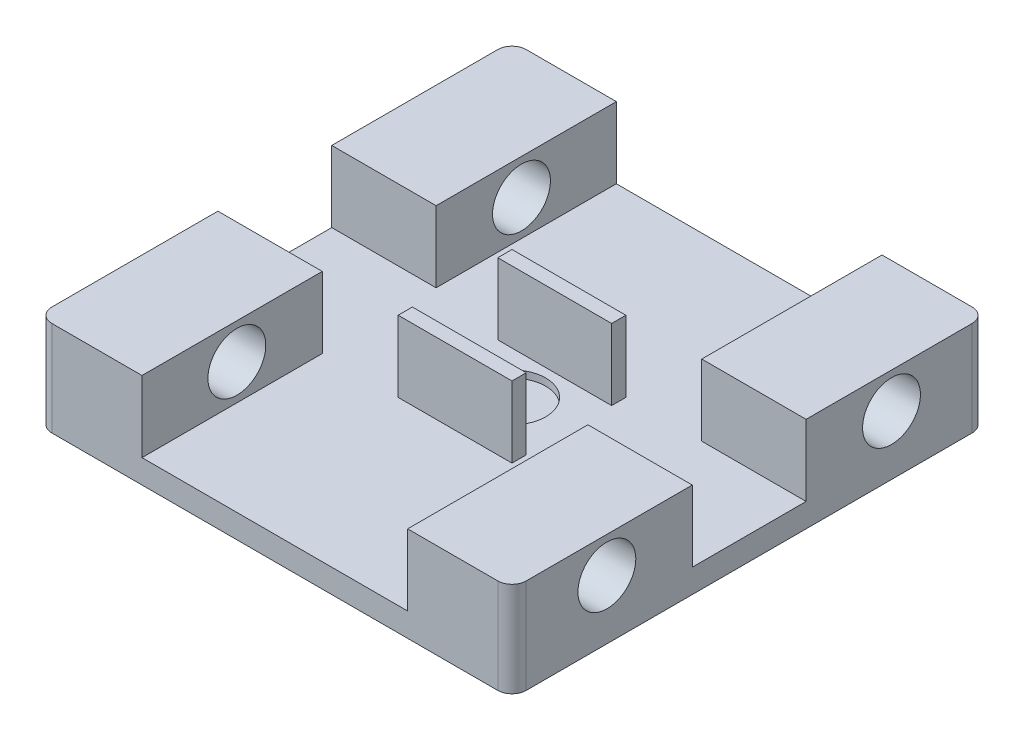
ISO-10303-21;
HEADER;
FILE_DESCRIPTION(('STEP AP214'),'2;1');
FILE_NAME('part.step','',(''),(''),'','','');
FILE_SCHEMA(('AUTOMOTIVE_DESIGN { 1 0 10303 214 1 1 1 1 }'));
ENDSEC;
DATA;
#1=APPLICATION_CONTEXT('core data for automotive mechanical design processes');
#2=APPLICATION_PROTOCOL_DEFINITION('international standard','automotive_design',2000,#1);
#3=PRODUCT_CONTEXT('',#1,'mechanical');
#4=PRODUCT('Part','Part','',(#3));
#5=PRODUCT_RELATED_PRODUCT_CATEGORY('part','',(#4));
#6=PRODUCT_DEFINITION_FORMATION('','',#4);
#7=PRODUCT_DEFINITION_CONTEXT('part definition',#1,'design');
#8=PRODUCT_DEFINITION('design','',#6,#7);
#9=PRODUCT_DEFINITION_SHAPE('','',#8);
#10=(LENGTH_UNIT() NAMED_UNIT(*) SI_UNIT(.MILLI.,.METRE.));
#11=(NAMED_UNIT(*) PLANE_ANGLE_UNIT() SI_UNIT($,.RADIAN.));
#12=(NAMED_UNIT(*) SI_UNIT($,.STERADIAN.) SOLID_ANGLE_UNIT());
#13=UNCERTAINTY_MEASURE_WITH_UNIT(LENGTH_MEASURE(1.E-05),#10,'distance_accuracy_value','');
#14=(GEOMETRIC_REPRESENTATION_CONTEXT(3) GLOBAL_UNCERTAINTY_ASSIGNED_CONTEXT((#13)) GLOBAL_UNIT_ASSIGNED_CONTEXT((#10,
#11,#12)) REPRESENTATION_CONTEXT('',''));
#15=CARTESIAN_POINT('',(0.,0.,0.));
#16=DIRECTION('',(0.,0.,1.));
#17=DIRECTION('',(1.,0.,0.));
#18=AXIS2_PLACEMENT_3D('',#15,#16,#17);
#19=CARTESIAN_POINT('',(0.,20.,0.));
#20=DIRECTION('',(0.,-1.,0.));
#21=DIRECTION('',(0.,0.,-1.));
#22=AXIS2_PLACEMENT_3D('',#19,#20,#21);
#23=PLANE('',#22);
#24=DIRECTION('',(0.,0.,-1.));
#25=VECTOR('',#24,1.);
#26=CARTESIAN_POINT('',(12.,20.,-12.));
#27=LINE('',#26,#25);
#28=CARTESIAN_POINT('',(12.,20.,12.));
#29=VERTEX_POINT('',#28);
#30=CARTESIAN_POINT('',(12.,20.,9.));
#31=VERTEX_POINT('',#30);
#32=EDGE_CURVE('E61',#29,#31,#27,.T.);
#33=ORIENTED_EDGE('',*,*,#32,.T.);
#34=DIRECTION('',(1.,0.,0.));
#35=VECTOR('',#34,1.);
#36=CARTESIAN_POINT('',(-20.,20.,9.));
#37=LINE('',#36,#35);
#38=CARTESIAN_POINT('',(-12.,20.,9.));
#39=VERTEX_POINT('',#38);
#40=EDGE_CURVE('E607',#39,#31,#37,.T.);
#41=ORIENTED_EDGE('',*,*,#40,.F.);
#42=DIRECTION('',(0.,0.,1.));
#43=VECTOR('',#42,1.);
#44=CARTESIAN_POINT('',(-12.,20.,-12.));
#45=LINE('',#44,#43);
#46=CARTESIAN_POINT('',(-12.,20.,12.));
#47=VERTEX_POINT('',#46);
#48=EDGE_CURVE('E266',#39,#47,#45,.T.);
#49=ORIENTED_EDGE('',*,*,#48,.T.);
#50=DIRECTION('',(1.,0.,0.));
#51=VECTOR('',#50,1.);
#52=CARTESIAN_POINT('',(12.,20.,12.));
#53=LINE('',#52,#51);
#54=EDGE_CURVE('E265',#47,#29,#53,.T.);
#55=ORIENTED_EDGE('',*,*,#54,.T.);
#56=EDGE_LOOP('',(#33,#41,#49,#55));
#57=FACE_BOUND('',#56,.T.);
#58=ADVANCED_FACE('F37',(#57),#23,.F.);
#59=CARTESIAN_POINT('',(-12.,5.,-12.));
#60=DIRECTION('',(-1.,0.,0.));
#61=DIRECTION('',(0.,0.,1.));
#62=AXIS2_PLACEMENT_3D('',#59,#60,#61);
#63=PLANE('',#62);
#64=DIRECTION('',(0.,1.,0.));
#65=VECTOR('',#64,1.);
#66=CARTESIAN_POINT('',(-12.,4.99999999999999,9.));
#67=LINE('',#66,#65);
#68=CARTESIAN_POINT('',(-12.,5.,9.));
#69=VERTEX_POINT('',#68);
#70=EDGE_CURVE('E609',#69,#39,#67,.T.);
#71=ORIENTED_EDGE('',*,*,#70,.F.);
#72=DIRECTION('',(0.,0.,1.));
#73=VECTOR('',#72,1.);
#74=CARTESIAN_POINT('',(-12.,5.,-12.));
#75=LINE('',#74,#73);
#76=CARTESIAN_POINT('',(-12.,5.,12.));
#77=VERTEX_POINT('',#76);
#78=EDGE_CURVE('E273',#69,#77,#75,.T.);
#79=ORIENTED_EDGE('',*,*,#78,.T.);
#80=DIRECTION('',(0.,1.,0.));
#81=VECTOR('',#80,1.);
#82=CARTESIAN_POINT('',(-12.,5.,12.));
#83=LINE('',#82,#81);
#84=EDGE_CURVE('E261',#77,#47,#83,.T.);
#85=ORIENTED_EDGE('',*,*,#84,.T.);
#86=ORIENTED_EDGE('',*,*,#48,.F.);
#87=EDGE_LOOP('',(#71,#79,#85,#86));
#88=FACE_BOUND('',#87,.T.);
#89=ADVANCED_FACE('F479',(#88),#63,.T.);
#90=CARTESIAN_POINT('',(12.,5.,-12.));
#91=DIRECTION('',(1.,0.,0.));
#92=DIRECTION('',(0.,0.,-1.));
#93=AXIS2_PLACEMENT_3D('',#90,#91,#92);
#94=PLANE('',#93);
#95=DIRECTION('',(0.,-1.,0.));
#96=VECTOR('',#95,1.);
#97=CARTESIAN_POINT('',(12.,20.,9.));
#98=LINE('',#97,#96);
#99=CARTESIAN_POINT('',(12.,5.,9.));
#100=VERTEX_POINT('',#99);
#101=EDGE_CURVE('E54',#31,#100,#98,.T.);
#102=ORIENTED_EDGE('',*,*,#101,.F.);
#103=ORIENTED_EDGE('',*,*,#32,.F.);
#104=DIRECTION('',(0.,1.,0.));
#105=VECTOR('',#104,1.);
#106=CARTESIAN_POINT('',(12.,5.,12.));
#107=LINE('',#106,#105);
#108=CARTESIAN_POINT('',(12.,5.,12.));
#109=VERTEX_POINT('',#108);
#110=EDGE_CURVE('E279',#109,#29,#107,.T.);
#111=ORIENTED_EDGE('',*,*,#110,.F.);
#112=DIRECTION('',(0.,0.,-1.));
#113=VECTOR('',#112,1.);
#114=CARTESIAN_POINT('',(12.,5.,-12.));
#115=LINE('',#114,#113);
#116=EDGE_CURVE('E251',#109,#100,#115,.T.);
#117=ORIENTED_EDGE('',*,*,#116,.T.);
#118=EDGE_LOOP('',(#102,#103,#111,#117));
#119=FACE_BOUND('',#118,.T.);
#120=ADVANCED_FACE('F472',(#119),#94,.T.);
#121=CARTESIAN_POINT('',(-12.,20.,-12.));
#122=VERTEX_POINT('',#121);
#123=CARTESIAN_POINT('',(-12.,20.,-9.));
#124=VERTEX_POINT('',#123);
#125=EDGE_CURVE('E262',#122,#124,#45,.T.);
#126=ORIENTED_EDGE('',*,*,#125,.T.);
#127=DIRECTION('',(1.,0.,0.));
#128=VECTOR('',#127,1.);
#129=CARTESIAN_POINT('',(-20.,20.,-9.));
#130=LINE('',#129,#128);
#131=CARTESIAN_POINT('',(12.,20.,-9.));
#132=VERTEX_POINT('',#131);
#133=EDGE_CURVE('E235',#124,#132,#130,.T.);
#134=ORIENTED_EDGE('',*,*,#133,.T.);
#135=CARTESIAN_POINT('',(12.,20.,-12.));
#136=VERTEX_POINT('',#135);
#137=EDGE_CURVE('E244',#132,#136,#27,.T.);
#138=ORIENTED_EDGE('',*,*,#137,.T.);
#139=DIRECTION('',(-1.,0.,0.));
#140=VECTOR('',#139,1.);
#141=CARTESIAN_POINT('',(12.,20.,-12.));
#142=LINE('',#141,#140);
#143=EDGE_CURVE('E270',#136,#122,#142,.T.);
#144=ORIENTED_EDGE('',*,*,#143,.T.);
#145=EDGE_LOOP('',(#126,#134,#138,#144));
#146=FACE_BOUND('',#145,.T.);
#147=ADVANCED_FACE('F462',(#146),#23,.F.);
#148=CARTESIAN_POINT('',(-28.,5.,-50.));
#149=DIRECTION('',(-1.,0.,0.));
#150=DIRECTION('',(0.,0.,1.));
#151=AXIS2_PLACEMENT_3D('',#148,#149,#150);
#152=PLANE('',#151);
#153=DIRECTION('',(0.,0.,1.));
#154=VECTOR('',#153,1.);
#155=CARTESIAN_POINT('',(-28.,20.,-50.));
#156=LINE('',#155,#154);
#157=CARTESIAN_POINT('',(-28.,20.,-50.));
#158=VERTEX_POINT('',#157);
#159=CARTESIAN_POINT('',(-28.,20.,-12.));
#160=VERTEX_POINT('',#159);
#161=EDGE_CURVE('E326',#158,#160,#156,.T.);
#162=ORIENTED_EDGE('',*,*,#161,.T.);
#163=DIRECTION('',(0.,1.,0.));
#164=VECTOR('',#163,1.);
#165=CARTESIAN_POINT('',(-28.,5.,-12.));
#166=LINE('',#165,#164);
#167=CARTESIAN_POINT('',(-28.,5.,-12.));
#168=VERTEX_POINT('',#167);
#169=EDGE_CURVE('E353',#168,#160,#166,.T.);
#170=ORIENTED_EDGE('',*,*,#169,.F.);
#171=DIRECTION('',(0.,0.,1.));
#172=VECTOR('',#171,1.);
#173=CARTESIAN_POINT('',(-28.,5.,-50.));
#174=LINE('',#173,#172);
#175=CARTESIAN_POINT('',(-28.,5.,-50.));
#176=VERTEX_POINT('',#175);
#177=EDGE_CURVE('E299',#176,#168,#174,.T.);
#178=ORIENTED_EDGE('',*,*,#177,.F.);
#179=DIRECTION('',(0.,1.,0.));
#180=VECTOR('',#179,1.);
#181=CARTESIAN_POINT('',(-28.,5.,-50.));
#182=LINE('',#181,#180);
#183=EDGE_CURVE('E355',#176,#158,#182,.T.);
#184=ORIENTED_EDGE('',*,*,#183,.T.);
#185=EDGE_LOOP('',(#162,#170,#178,#184));
#186=FACE_BOUND('',#185,.T.);
#187=CARTESIAN_POINT('',(-28.,12.5,-30.));
#188=DIRECTION('',(-1.,0.,0.));
#189=DIRECTION('',(0.,0.,1.));
#190=AXIS2_PLACEMENT_3D('',#187,#188,#189);
#191=CIRCLE('',#190,6.1);
#192=CARTESIAN_POINT('',(-28.,12.5,-23.9));
#193=VERTEX_POINT('',#192);
#194=EDGE_CURVE('E41',#193,#193,#191,.F.);
#195=ORIENTED_EDGE('',*,*,#194,.F.);
#196=EDGE_LOOP('',(#195));
#197=FACE_BOUND('',#196,.T.);
#198=ADVANCED_FACE('F459',(#186,#197),#152,.F.);
#199=CARTESIAN_POINT('',(28.,5.,-50.));
#200=DIRECTION('',(1.,0.,0.));
#201=DIRECTION('',(0.,0.,-1.));
#202=AXIS2_PLACEMENT_3D('',#199,#200,#201);
#203=PLANE('',#202);
#204=DIRECTION('',(0.,0.,-1.));
#205=VECTOR('',#204,1.);
#206=CARTESIAN_POINT('',(28.,20.,-50.));
#207=LINE('',#206,#205);
#208=CARTESIAN_POINT('',(28.,20.,-12.));
#209=VERTEX_POINT('',#208);
#210=CARTESIAN_POINT('',(28.,20.,-50.));
#211=VERTEX_POINT('',#210);
#212=EDGE_CURVE('E324',#209,#211,#207,.T.);
#213=ORIENTED_EDGE('',*,*,#212,.T.);
#214=DIRECTION('',(0.,1.,0.));
#215=VECTOR('',#214,1.);
#216=CARTESIAN_POINT('',(28.,5.,-50.));
#217=LINE('',#216,#215);
#218=CARTESIAN_POINT('',(28.,5.,-50.));
#219=VERTEX_POINT('',#218);
#220=EDGE_CURVE('E357',#219,#211,#217,.T.);
#221=ORIENTED_EDGE('',*,*,#220,.F.);
#222=DIRECTION('',(0.,0.,-1.));
#223=VECTOR('',#222,1.);
#224=CARTESIAN_POINT('',(28.,5.,-50.));
#225=LINE('',#224,#223);
#226=CARTESIAN_POINT('',(28.,5.,-12.));
#227=VERTEX_POINT('',#226);
#228=EDGE_CURVE('E293',#227,#219,#225,.T.);
#229=ORIENTED_EDGE('',*,*,#228,.F.);
#230=DIRECTION('',(0.,1.,0.));
#231=VECTOR('',#230,1.);
#232=CARTESIAN_POINT('',(28.,5.,-12.));
#233=LINE('',#232,#231);
#234=EDGE_CURVE('E360',#227,#209,#233,.T.);
#235=ORIENTED_EDGE('',*,*,#234,.T.);
#236=EDGE_LOOP('',(#213,#221,#229,#235));
#237=FACE_BOUND('',#236,.T.);
#238=CARTESIAN_POINT('',(28.,12.5,-30.));
#239=DIRECTION('',(1.,0.,0.));
#240=DIRECTION('',(0.,0.,-1.));
#241=AXIS2_PLACEMENT_3D('',#238,#239,#240);
#242=CIRCLE('',#241,6.1);
#243=CARTESIAN_POINT('',(28.,12.5,-36.1));
#244=VERTEX_POINT('',#243);
#245=EDGE_CURVE('E449',#244,#244,#242,.F.);
#246=ORIENTED_EDGE('',*,*,#245,.F.);
#247=EDGE_LOOP('',(#246));
#248=FACE_BOUND('',#247,.T.);
#249=ADVANCED_FACE('F461',(#237,#248),#203,.F.);
#250=CARTESIAN_POINT('',(28.,5.,12.));
#251=DIRECTION('',(1.,0.,0.));
#252=DIRECTION('',(0.,0.,-1.));
#253=AXIS2_PLACEMENT_3D('',#250,#251,#252);
#254=PLANE('',#253);
#255=DIRECTION('',(0.,0.,-1.));
#256=VECTOR('',#255,1.);
#257=CARTESIAN_POINT('',(28.,20.,12.));
#258=LINE('',#257,#256);
#259=CARTESIAN_POINT('',(28.,20.,50.));
#260=VERTEX_POINT('',#259);
#261=CARTESIAN_POINT('',(28.,20.,12.));
#262=VERTEX_POINT('',#261);
#263=EDGE_CURVE('E287',#260,#262,#258,.T.);
#264=ORIENTED_EDGE('',*,*,#263,.T.);
#265=DIRECTION('',(0.,1.,0.));
#266=VECTOR('',#265,1.);
#267=CARTESIAN_POINT('',(28.,5.,12.));
#268=LINE('',#267,#266);
#269=CARTESIAN_POINT('',(28.,5.,12.));
#270=VERTEX_POINT('',#269);
#271=EDGE_CURVE('E338',#270,#262,#268,.T.);
#272=ORIENTED_EDGE('',*,*,#271,.F.);
#273=DIRECTION('',(0.,0.,-1.));
#274=VECTOR('',#273,1.);
#275=CARTESIAN_POINT('',(28.,5.,12.));
#276=LINE('',#275,#274);
#277=CARTESIAN_POINT('',(28.,5.,50.));
#278=VERTEX_POINT('',#277);
#279=EDGE_CURVE('E316',#278,#270,#276,.T.);
#280=ORIENTED_EDGE('',*,*,#279,.F.);
#281=DIRECTION('',(0.,1.,0.));
#282=VECTOR('',#281,1.);
#283=CARTESIAN_POINT('',(28.,5.,50.));
#284=LINE('',#283,#282);
#285=EDGE_CURVE('E341',#278,#260,#284,.T.);
#286=ORIENTED_EDGE('',*,*,#285,.T.);
#287=EDGE_LOOP('',(#264,#272,#280,#286));
#288=FACE_BOUND('',#287,.T.);
#289=CARTESIAN_POINT('',(28.,12.5,30.));
#290=DIRECTION('',(1.,0.,0.));
#291=DIRECTION('',(0.,0.,-1.));
#292=AXIS2_PLACEMENT_3D('',#289,#290,#291);
#293=CIRCLE('',#292,6.1);
#294=CARTESIAN_POINT('',(28.,12.5,23.9));
#295=VERTEX_POINT('',#294);
#296=EDGE_CURVE('E447',#295,#295,#293,.F.);
#297=ORIENTED_EDGE('',*,*,#296,.F.);
#298=EDGE_LOOP('',(#297));
#299=FACE_BOUND('',#298,.T.);
#300=ADVANCED_FACE('F469',(#288,#299),#254,.F.);
#301=CARTESIAN_POINT('',(-28.,5.,12.));
#302=DIRECTION('',(-1.,0.,0.));
#303=DIRECTION('',(0.,0.,1.));
#304=AXIS2_PLACEMENT_3D('',#301,#302,#303);
#305=PLANE('',#304);
#306=DIRECTION('',(0.,0.,1.));
#307=VECTOR('',#306,1.);
#308=CARTESIAN_POINT('',(-28.,20.,12.));
#309=LINE('',#308,#307);
#310=CARTESIAN_POINT('',(-28.,20.,12.));
#311=VERTEX_POINT('',#310);
#312=CARTESIAN_POINT('',(-28.,20.,50.));
#313=VERTEX_POINT('',#312);
#314=EDGE_CURVE('E334',#311,#313,#309,.T.);
#315=ORIENTED_EDGE('',*,*,#314,.T.);
#316=DIRECTION('',(0.,1.,0.));
#317=VECTOR('',#316,1.);
#318=CARTESIAN_POINT('',(-28.,5.,50.));
#319=LINE('',#318,#317);
#320=CARTESIAN_POINT('',(-28.,5.,50.));
#321=VERTEX_POINT('',#320);
#322=EDGE_CURVE('E343',#321,#313,#319,.T.);
#323=ORIENTED_EDGE('',*,*,#322,.F.);
#324=DIRECTION('',(0.,0.,1.));
#325=VECTOR('',#324,1.);
#326=CARTESIAN_POINT('',(-28.,5.,12.));
#327=LINE('',#326,#325);
#328=CARTESIAN_POINT('',(-28.,5.,12.));
#329=VERTEX_POINT('',#328);
#330=EDGE_CURVE('E311',#329,#321,#327,.T.);
#331=ORIENTED_EDGE('',*,*,#330,.F.);
#332=DIRECTION('',(0.,1.,0.));
#333=VECTOR('',#332,1.);
#334=CARTESIAN_POINT('',(-28.,5.,12.));
#335=LINE('',#334,#333);
#336=EDGE_CURVE('E346',#329,#311,#335,.T.);
#337=ORIENTED_EDGE('',*,*,#336,.T.);
#338=EDGE_LOOP('',(#315,#323,#331,#337));
#339=FACE_BOUND('',#338,.T.);
#340=CARTESIAN_POINT('',(-28.,12.5,30.));
#341=DIRECTION('',(-1.,0.,0.));
#342=DIRECTION('',(0.,0.,1.));
#343=AXIS2_PLACEMENT_3D('',#340,#341,#342);
#344=CIRCLE('',#343,6.1);
#345=CARTESIAN_POINT('',(-28.,12.5,36.1));
#346=VERTEX_POINT('',#345);
#347=EDGE_CURVE('E340',#346,#346,#344,.F.);
#348=ORIENTED_EDGE('',*,*,#347,.F.);
#349=EDGE_LOOP('',(#348));
#350=FACE_BOUND('',#349,.T.);
#351=ADVANCED_FACE('F571',(#339,#350),#305,.F.);
#352=CARTESIAN_POINT('',(28.,5.,12.));
#353=DIRECTION('',(0.,0.,1.));
#354=DIRECTION('',(1.,0.,0.));
#355=AXIS2_PLACEMENT_3D('',#352,#353,#354);
#356=PLANE('',#355);
#357=DIRECTION('',(1.,0.,0.));
#358=VECTOR('',#357,1.);
#359=CARTESIAN_POINT('',(28.,20.,12.));
#360=LINE('',#359,#358);
#361=CARTESIAN_POINT('',(50.,20.,12.));
#362=VERTEX_POINT('',#361);
#363=EDGE_CURVE('E276',#262,#362,#360,.T.);
#364=ORIENTED_EDGE('',*,*,#363,.T.);
#365=DIRECTION('',(0.,1.,0.));
#366=VECTOR('',#365,1.);
#367=CARTESIAN_POINT('',(50.,5.,12.));
#368=LINE('',#367,#366);
#369=CARTESIAN_POINT('',(50.,5.,12.));
#370=VERTEX_POINT('',#369);
#371=EDGE_CURVE('E319',#370,#362,#368,.T.);
#372=ORIENTED_EDGE('',*,*,#371,.F.);
#373=DIRECTION('',(1.,0.,0.));
#374=VECTOR('',#373,1.);
#375=CARTESIAN_POINT('',(28.,5.,12.));
#376=LINE('',#375,#374);
#377=EDGE_CURVE('E283',#270,#370,#376,.T.);
#378=ORIENTED_EDGE('',*,*,#377,.F.);
#379=ORIENTED_EDGE('',*,*,#271,.T.);
#380=EDGE_LOOP('',(#364,#372,#378,#379));
#381=FACE_BOUND('',#380,.T.);
#382=ADVANCED_FACE('F563',(#381),#356,.F.);
#383=CARTESIAN_POINT('',(-50.,5.,12.));
#384=DIRECTION('',(0.,0.,1.));
#385=DIRECTION('',(1.,0.,0.));
#386=AXIS2_PLACEMENT_3D('',#383,#384,#385);
#387=PLANE('',#386);
#388=DIRECTION('',(1.,0.,0.));
#389=VECTOR('',#388,1.);
#390=CARTESIAN_POINT('',(-50.,20.,12.));
#391=LINE('',#390,#389);
#392=CARTESIAN_POINT('',(-50.,20.,12.));
#393=VERTEX_POINT('',#392);
#394=EDGE_CURVE('E331',#393,#311,#391,.T.);
#395=ORIENTED_EDGE('',*,*,#394,.T.);
#396=ORIENTED_EDGE('',*,*,#336,.F.);
#397=DIRECTION('',(1.,0.,0.));
#398=VECTOR('',#397,1.);
#399=CARTESIAN_POINT('',(-50.,5.,12.));
#400=LINE('',#399,#398);
#401=CARTESIAN_POINT('',(-50.,5.,12.));
#402=VERTEX_POINT('',#401);
#403=EDGE_CURVE('E308',#402,#329,#400,.T.);
#404=ORIENTED_EDGE('',*,*,#403,.F.);
#405=DIRECTION('',(0.,1.,0.));
#406=VECTOR('',#405,1.);
#407=CARTESIAN_POINT('',(-50.,5.,12.));
#408=LINE('',#407,#406);
#409=EDGE_CURVE('E348',#402,#393,#408,.T.);
#410=ORIENTED_EDGE('',*,*,#409,.T.);
#411=EDGE_LOOP('',(#395,#396,#404,#410));
#412=FACE_BOUND('',#411,.T.);
#413=ADVANCED_FACE('F647',(#412),#387,.F.);
#414=CARTESIAN_POINT('',(-50.,5.,-12.));
#415=DIRECTION('',(0.,0.,-1.));
#416=DIRECTION('',(-1.,0.,0.));
#417=AXIS2_PLACEMENT_3D('',#414,#415,#416);
#418=PLANE('',#417);
#419=DIRECTION('',(-1.,0.,0.));
#420=VECTOR('',#419,1.);
#421=CARTESIAN_POINT('',(-50.,20.,-12.));
#422=LINE('',#421,#420);
#423=CARTESIAN_POINT('',(-50.,20.,-12.));
#424=VERTEX_POINT('',#423);
#425=EDGE_CURVE('E329',#160,#424,#422,.T.);
#426=ORIENTED_EDGE('',*,*,#425,.T.);
#427=DIRECTION('',(0.,1.,0.));
#428=VECTOR('',#427,1.);
#429=CARTESIAN_POINT('',(-50.,5.,-12.));
#430=LINE('',#429,#428);
#431=CARTESIAN_POINT('',(-50.,5.,-12.));
#432=VERTEX_POINT('',#431);
#433=EDGE_CURVE('E350',#432,#424,#430,.T.);
#434=ORIENTED_EDGE('',*,*,#433,.F.);
#435=DIRECTION('',(-1.,0.,0.));
#436=VECTOR('',#435,1.);
#437=CARTESIAN_POINT('',(-50.,5.,-12.));
#438=LINE('',#437,#436);
#439=EDGE_CURVE('E302',#168,#432,#438,.T.);
#440=ORIENTED_EDGE('',*,*,#439,.F.);
#441=ORIENTED_EDGE('',*,*,#169,.T.);
#442=EDGE_LOOP('',(#426,#434,#440,#441));
#443=FACE_BOUND('',#442,.T.);
#444=ADVANCED_FACE('F649',(#443),#418,.F.);
#445=CARTESIAN_POINT('',(28.,5.,-12.));
#446=DIRECTION('',(0.,0.,-1.));
#447=DIRECTION('',(-1.,0.,0.));
#448=AXIS2_PLACEMENT_3D('',#445,#446,#447);
#449=PLANE('',#448);
#450=DIRECTION('',(-1.,0.,0.));
#451=VECTOR('',#450,1.);
#452=CARTESIAN_POINT('',(28.,20.,-12.));
#453=LINE('',#452,#451);
#454=CARTESIAN_POINT('',(50.,20.,-12.));
#455=VERTEX_POINT('',#454);
#456=EDGE_CURVE('E321',#455,#209,#453,.T.);
#457=ORIENTED_EDGE('',*,*,#456,.T.);
#458=ORIENTED_EDGE('',*,*,#234,.F.);
#459=DIRECTION('',(-1.,0.,0.));
#460=VECTOR('',#459,1.);
#461=CARTESIAN_POINT('',(28.,5.,-12.));
#462=LINE('',#461,#460);
#463=CARTESIAN_POINT('',(50.,5.,-12.));
#464=VERTEX_POINT('',#463);
#465=EDGE_CURVE('E290',#464,#227,#462,.T.);
#466=ORIENTED_EDGE('',*,*,#465,.F.);
#467=DIRECTION('',(0.,1.,0.));
#468=VECTOR('',#467,1.);
#469=CARTESIAN_POINT('',(50.,5.,-12.));
#470=LINE('',#469,#468);
#471=EDGE_CURVE('E362',#464,#455,#470,.T.);
#472=ORIENTED_EDGE('',*,*,#471,.T.);
#473=EDGE_LOOP('',(#457,#458,#466,#472));
#474=FACE_BOUND('',#473,.T.);
#475=ADVANCED_FACE('F558',(#474),#449,.F.);
#476=CARTESIAN_POINT('',(0.,5.,0.));
#477=DIRECTION('',(0.,-1.,0.));
#478=DIRECTION('',(0.,0.,-1.));
#479=AXIS2_PLACEMENT_3D('',#476,#477,#478);
#480=PLANE('',#479);
#481=DIRECTION('',(1.,0.,0.));
#482=VECTOR('',#481,1.);
#483=CARTESIAN_POINT('',(-20.,5.,-9.));
#484=LINE('',#483,#482);
#485=CARTESIAN_POINT('',(-12.,5.,-9.));
#486=VERTEX_POINT('',#485);
#487=CARTESIAN_POINT('',(12.,5.,-9.));
#488=VERTEX_POINT('',#487);
#489=EDGE_CURVE('E224',#486,#488,#484,.T.);
#490=ORIENTED_EDGE('',*,*,#489,.F.);
#491=CARTESIAN_POINT('',(-12.,5.,-12.));
#492=VERTEX_POINT('',#491);
#493=EDGE_CURVE('E256',#492,#486,#75,.T.);
#494=ORIENTED_EDGE('',*,*,#493,.F.);
#495=DIRECTION('',(-1.,0.,0.));
#496=VECTOR('',#495,1.);
#497=CARTESIAN_POINT('',(12.,5.,-12.));
#498=LINE('',#497,#496);
#499=CARTESIAN_POINT('',(12.,5.,-12.));
#500=VERTEX_POINT('',#499);
#501=EDGE_CURVE('E250',#500,#492,#498,.T.);
#502=ORIENTED_EDGE('',*,*,#501,.F.);
#503=EDGE_CURVE('E242',#488,#500,#115,.T.);
#504=ORIENTED_EDGE('',*,*,#503,.F.);
#505=EDGE_LOOP('',(#490,#494,#502,#504));
#506=FACE_BOUND('',#505,.T.);
#507=ORIENTED_EDGE('',*,*,#78,.F.);
#508=DIRECTION('',(1.,0.,0.));
#509=VECTOR('',#508,1.);
#510=CARTESIAN_POINT('',(-20.,5.,9.));
#511=LINE('',#510,#509);
#512=EDGE_CURVE('E236',#69,#100,#511,.T.);
#513=ORIENTED_EDGE('',*,*,#512,.T.);
#514=ORIENTED_EDGE('',*,*,#116,.F.);
#515=DIRECTION('',(1.,0.,0.));
#516=VECTOR('',#515,1.);
#517=CARTESIAN_POINT('',(12.,5.,12.));
#518=LINE('',#517,#516);
#519=EDGE_CURVE('E252',#77,#109,#518,.T.);
#520=ORIENTED_EDGE('',*,*,#519,.F.);
#521=EDGE_LOOP('',(#507,#513,#514,#520));
#522=FACE_BOUND('',#521,.T.);
#523=ORIENTED_EDGE('',*,*,#377,.T.);
#524=DIRECTION('',(0.,0.,-1.));
#525=VECTOR('',#524,1.);
#526=CARTESIAN_POINT('',(50.,5.,-12.));
#527=LINE('',#526,#525);
#528=EDGE_CURVE('E286',#370,#464,#527,.T.);
#529=ORIENTED_EDGE('',*,*,#528,.T.);
#530=ORIENTED_EDGE('',*,*,#465,.T.);
#531=ORIENTED_EDGE('',*,*,#228,.T.);
#532=DIRECTION('',(-1.,0.,0.));
#533=VECTOR('',#532,1.);
#534=CARTESIAN_POINT('',(28.,5.,-50.));
#535=LINE('',#534,#533);
#536=EDGE_CURVE('E296',#219,#176,#535,.T.);
#537=ORIENTED_EDGE('',*,*,#536,.T.);
#538=ORIENTED_EDGE('',*,*,#177,.T.);
#539=ORIENTED_EDGE('',*,*,#439,.T.);
#540=DIRECTION('',(0.,0.,1.));
#541=VECTOR('',#540,1.);
#542=CARTESIAN_POINT('',(-50.,5.,-12.));
#543=LINE('',#542,#541);
#544=EDGE_CURVE('E305',#432,#402,#543,.T.);
#545=ORIENTED_EDGE('',*,*,#544,.T.);
#546=ORIENTED_EDGE('',*,*,#403,.T.);
#547=ORIENTED_EDGE('',*,*,#330,.T.);
#548=DIRECTION('',(1.,0.,0.));
#549=VECTOR('',#548,1.);
#550=CARTESIAN_POINT('',(28.,5.,50.));
#551=LINE('',#550,#549);
#552=EDGE_CURVE('E314',#321,#278,#551,.T.);
#553=ORIENTED_EDGE('',*,*,#552,.T.);
#554=ORIENTED_EDGE('',*,*,#279,.T.);
#555=EDGE_LOOP('',(#523,#529,#530,#531,#537,#538,#539,#545,#546,#547,#553,#554));
#556=FACE_BOUND('',#555,.T.);
#557=CARTESIAN_POINT('',(0.,5.,0.));
#558=DIRECTION('',(0.,-1.,0.));
#559=DIRECTION('',(0.,0.,-1.));
#560=AXIS2_PLACEMENT_3D('',#557,#558,#559);
#561=CIRCLE('',#560,7.1);
#562=CARTESIAN_POINT('',(0.,5.,-7.1));
#563=VERTEX_POINT('',#562);
#564=EDGE_CURVE('E605',#563,#563,#561,.F.);
#565=ORIENTED_EDGE('',*,*,#564,.F.);
#566=EDGE_LOOP('',(#565));
#567=FACE_BOUND('',#566,.T.);
#568=ADVANCED_FACE('F247',(#506,#522,#556,#567),#480,.F.);
#569=DIRECTION('',(0.,-1.,0.));
#570=VECTOR('',#569,1.);
#571=CARTESIAN_POINT('',(-12.,5.,-9.));
#572=LINE('',#571,#570);
#573=EDGE_CURVE('E230',#124,#486,#572,.T.);
#574=ORIENTED_EDGE('',*,*,#573,.F.);
#575=ORIENTED_EDGE('',*,*,#125,.F.);
#576=DIRECTION('',(0.,1.,0.));
#577=VECTOR('',#576,1.);
#578=CARTESIAN_POINT('',(-12.,5.,-12.));
#579=LINE('',#578,#577);
#580=EDGE_CURVE('E274',#492,#122,#579,.T.);
#581=ORIENTED_EDGE('',*,*,#580,.F.);
#582=ORIENTED_EDGE('',*,*,#493,.T.);
#583=EDGE_LOOP('',(#574,#575,#581,#582));
#584=FACE_BOUND('',#583,.T.);
#585=ADVANCED_FACE('F487',(#584),#63,.T.);
#586=CARTESIAN_POINT('',(12.,5.,-12.));
#587=DIRECTION('',(0.,0.,-1.));
#588=DIRECTION('',(-1.,0.,0.));
#589=AXIS2_PLACEMENT_3D('',#586,#587,#588);
#590=PLANE('',#589);
#591=ORIENTED_EDGE('',*,*,#143,.F.);
#592=DIRECTION('',(0.,1.,0.));
#593=VECTOR('',#592,1.);
#594=CARTESIAN_POINT('',(12.,5.,-12.));
#595=LINE('',#594,#593);
#596=EDGE_CURVE('E277',#500,#136,#595,.T.);
#597=ORIENTED_EDGE('',*,*,#596,.F.);
#598=ORIENTED_EDGE('',*,*,#501,.T.);
#599=ORIENTED_EDGE('',*,*,#580,.T.);
#600=EDGE_LOOP('',(#591,#597,#598,#599));
#601=FACE_BOUND('',#600,.T.);
#602=ADVANCED_FACE('F629',(#601),#590,.T.);
#603=DIRECTION('',(0.,1.,0.));
#604=VECTOR('',#603,1.);
#605=CARTESIAN_POINT('',(12.,20.,-9.));
#606=LINE('',#605,#604);
#607=EDGE_CURVE('E227',#488,#132,#606,.T.);
#608=ORIENTED_EDGE('',*,*,#607,.F.);
#609=ORIENTED_EDGE('',*,*,#503,.T.);
#610=ORIENTED_EDGE('',*,*,#596,.T.);
#611=ORIENTED_EDGE('',*,*,#137,.F.);
#612=EDGE_LOOP('',(#608,#609,#610,#611));
#613=FACE_BOUND('',#612,.T.);
#614=ADVANCED_FACE('F240',(#613),#94,.T.);
#615=CARTESIAN_POINT('',(12.,5.,12.));
#616=DIRECTION('',(0.,0.,1.));
#617=DIRECTION('',(1.,0.,0.));
#618=AXIS2_PLACEMENT_3D('',#615,#616,#617);
#619=PLANE('',#618);
#620=ORIENTED_EDGE('',*,*,#54,.F.);
#621=ORIENTED_EDGE('',*,*,#84,.F.);
#622=ORIENTED_EDGE('',*,*,#519,.T.);
#623=ORIENTED_EDGE('',*,*,#110,.T.);
#624=EDGE_LOOP('',(#620,#621,#622,#623));
#625=FACE_BOUND('',#624,.T.);
#626=ADVANCED_FACE('F622',(#625),#619,.T.);
#627=CARTESIAN_POINT('',(0.,0.,0.));
#628=DIRECTION('',(0.,-1.,0.));
#629=DIRECTION('',(0.,0.,-1.));
#630=AXIS2_PLACEMENT_3D('',#627,#628,#629);
#631=PLANE('',#630);
#632=DIRECTION('',(0.,0.,1.));
#633=VECTOR('',#632,1.);
#634=CARTESIAN_POINT('',(-50.,0.,50.));
#635=LINE('',#634,#633);
#636=CARTESIAN_POINT('',(-50.,0.,-47.));
#637=VERTEX_POINT('',#636);
#638=CARTESIAN_POINT('',(-50.,0.,47.));
#639=VERTEX_POINT('',#638);
#640=EDGE_CURVE('E404',#637,#639,#635,.T.);
#641=ORIENTED_EDGE('',*,*,#640,.F.);
#642=CARTESIAN_POINT('',(-47.,0.,-47.));
#643=DIRECTION('',(0.,-1.,0.));
#644=DIRECTION('',(0.,0.,-1.));
#645=AXIS2_PLACEMENT_3D('',#642,#643,#644);
#646=CIRCLE('',#645,3.);
#647=CARTESIAN_POINT('',(-47.,0.,-50.));
#648=VERTEX_POINT('',#647);
#649=EDGE_CURVE('E421',#637,#648,#646,.T.);
#650=ORIENTED_EDGE('',*,*,#649,.T.);
#651=DIRECTION('',(-1.,0.,0.));
#652=VECTOR('',#651,1.);
#653=CARTESIAN_POINT('',(-50.,0.,-50.));
#654=LINE('',#653,#652);
#655=CARTESIAN_POINT('',(47.,0.,-50.));
#656=VERTEX_POINT('',#655);
#657=EDGE_CURVE('E401',#656,#648,#654,.T.);
#658=ORIENTED_EDGE('',*,*,#657,.F.);
#659=CARTESIAN_POINT('',(47.,0.,-47.));
#660=DIRECTION('',(0.,-1.,0.));
#661=DIRECTION('',(0.,0.,-1.));
#662=AXIS2_PLACEMENT_3D('',#659,#660,#661);
#663=CIRCLE('',#662,3.);
#664=CARTESIAN_POINT('',(50.,0.,-47.));
#665=VERTEX_POINT('',#664);
#666=EDGE_CURVE('E415',#656,#665,#663,.T.);
#667=ORIENTED_EDGE('',*,*,#666,.T.);
#668=DIRECTION('',(0.,0.,-1.));
#669=VECTOR('',#668,1.);
#670=CARTESIAN_POINT('',(50.,0.,50.));
#671=LINE('',#670,#669);
#672=CARTESIAN_POINT('',(50.,0.,47.));
#673=VERTEX_POINT('',#672);
#674=EDGE_CURVE('E381',#673,#665,#671,.T.);
#675=ORIENTED_EDGE('',*,*,#674,.F.);
#676=CARTESIAN_POINT('',(47.,0.,47.));
#677=DIRECTION('',(0.,-1.,0.));
#678=DIRECTION('',(0.,0.,-1.));
#679=AXIS2_PLACEMENT_3D('',#676,#677,#678);
#680=CIRCLE('',#679,3.);
#681=CARTESIAN_POINT('',(47.,0.,50.));
#682=VERTEX_POINT('',#681);
#683=EDGE_CURVE('E417',#673,#682,#680,.T.);
#684=ORIENTED_EDGE('',*,*,#683,.T.);
#685=DIRECTION('',(1.,0.,0.));
#686=VECTOR('',#685,1.);
#687=CARTESIAN_POINT('',(-50.,0.,50.));
#688=LINE('',#687,#686);
#689=CARTESIAN_POINT('',(-47.,0.,50.));
#690=VERTEX_POINT('',#689);
#691=EDGE_CURVE('E407',#690,#682,#688,.T.);
#692=ORIENTED_EDGE('',*,*,#691,.F.);
#693=CARTESIAN_POINT('',(-47.,0.,47.));
#694=DIRECTION('',(0.,-1.,0.));
#695=DIRECTION('',(0.,0.,-1.));
#696=AXIS2_PLACEMENT_3D('',#693,#694,#695);
#697=CIRCLE('',#696,3.);
#698=EDGE_CURVE('E419',#690,#639,#697,.T.);
#699=ORIENTED_EDGE('',*,*,#698,.T.);
#700=EDGE_LOOP('',(#641,#650,#658,#667,#675,#684,#692,#699));
#701=FACE_BOUND('',#700,.T.);
#702=ADVANCED_FACE('F519',(#701),#631,.T.);
#703=CARTESIAN_POINT('',(47.,20.,47.));
#704=DIRECTION('',(0.,-1.,0.));
#705=DIRECTION('',(0.,0.,-1.));
#706=AXIS2_PLACEMENT_3D('',#703,#704,#705);
#707=CYLINDRICAL_SURFACE('',#706,3.);
#708=CARTESIAN_POINT('',(47.,20.,47.));
#709=DIRECTION('',(0.,-1.,0.));
#710=DIRECTION('',(0.,0.,-1.));
#711=AXIS2_PLACEMENT_3D('',#708,#709,#710);
#712=CIRCLE('',#711,3.);
#713=CARTESIAN_POINT('',(47.,20.,50.));
#714=VERTEX_POINT('',#713);
#715=CARTESIAN_POINT('',(50.,20.,47.));
#716=VERTEX_POINT('',#715);
#717=EDGE_CURVE('E431',#714,#716,#712,.F.);
#718=ORIENTED_EDGE('',*,*,#717,.F.);
#719=DIRECTION('',(0.,-1.,0.));
#720=VECTOR('',#719,1.);
#721=CARTESIAN_POINT('',(47.,20.,50.));
#722=LINE('',#721,#720);
#723=EDGE_CURVE('E437',#682,#714,#722,.F.);
#724=ORIENTED_EDGE('',*,*,#723,.F.);
#725=ORIENTED_EDGE('',*,*,#683,.F.);
#726=DIRECTION('',(0.,-1.,0.));
#727=VECTOR('',#726,1.);
#728=CARTESIAN_POINT('',(50.,20.,47.));
#729=LINE('',#728,#727);
#730=EDGE_CURVE('E11',#716,#673,#729,.T.);
#731=ORIENTED_EDGE('',*,*,#730,.F.);
#732=EDGE_LOOP('',(#718,#724,#725,#731));
#733=FACE_BOUND('',#732,.T.);
#734=ADVANCED_FACE('F528',(#733),#707,.T.);
#735=CARTESIAN_POINT('',(-47.,20.,47.));
#736=DIRECTION('',(0.,-1.,0.));
#737=DIRECTION('',(0.,0.,-1.));
#738=AXIS2_PLACEMENT_3D('',#735,#736,#737);
#739=CYLINDRICAL_SURFACE('',#738,3.);
#740=CARTESIAN_POINT('',(-47.,20.,47.));
#741=DIRECTION('',(0.,-1.,0.));
#742=DIRECTION('',(0.,0.,-1.));
#743=AXIS2_PLACEMENT_3D('',#740,#741,#742);
#744=CIRCLE('',#743,3.);
#745=CARTESIAN_POINT('',(-50.,20.,47.));
#746=VERTEX_POINT('',#745);
#747=CARTESIAN_POINT('',(-47.,20.,50.));
#748=VERTEX_POINT('',#747);
#749=EDGE_CURVE('E433',#746,#748,#744,.F.);
#750=ORIENTED_EDGE('',*,*,#749,.F.);
#751=DIRECTION('',(0.,-1.,0.));
#752=VECTOR('',#751,1.);
#753=CARTESIAN_POINT('',(-50.,20.,47.));
#754=LINE('',#753,#752);
#755=EDGE_CURVE('E398',#639,#746,#754,.F.);
#756=ORIENTED_EDGE('',*,*,#755,.F.);
#757=ORIENTED_EDGE('',*,*,#698,.F.);
#758=DIRECTION('',(0.,-1.,0.));
#759=VECTOR('',#758,1.);
#760=CARTESIAN_POINT('',(-47.,20.,50.));
#761=LINE('',#760,#759);
#762=EDGE_CURVE('E440',#748,#690,#761,.T.);
#763=ORIENTED_EDGE('',*,*,#762,.F.);
#764=EDGE_LOOP('',(#750,#756,#757,#763));
#765=FACE_BOUND('',#764,.T.);
#766=ADVANCED_FACE('F537',(#765),#739,.T.);
#767=CARTESIAN_POINT('',(-47.,20.,-47.));
#768=DIRECTION('',(0.,-1.,0.));
#769=DIRECTION('',(0.,0.,-1.));
#770=AXIS2_PLACEMENT_3D('',#767,#768,#769);
#771=CYLINDRICAL_SURFACE('',#770,3.);
#772=CARTESIAN_POINT('',(-47.,20.,-47.));
#773=DIRECTION('',(0.,-1.,0.));
#774=DIRECTION('',(0.,0.,-1.));
#775=AXIS2_PLACEMENT_3D('',#772,#773,#774);
#776=CIRCLE('',#775,3.);
#777=CARTESIAN_POINT('',(-47.,20.,-50.));
#778=VERTEX_POINT('',#777);
#779=CARTESIAN_POINT('',(-50.,20.,-47.));
#780=VERTEX_POINT('',#779);
#781=EDGE_CURVE('E435',#778,#780,#776,.F.);
#782=ORIENTED_EDGE('',*,*,#781,.F.);
#783=DIRECTION('',(0.,-1.,0.));
#784=VECTOR('',#783,1.);
#785=CARTESIAN_POINT('',(-47.,20.,-50.));
#786=LINE('',#785,#784);
#787=EDGE_CURVE('E426',#648,#778,#786,.F.);
#788=ORIENTED_EDGE('',*,*,#787,.F.);
#789=ORIENTED_EDGE('',*,*,#649,.F.);
#790=DIRECTION('',(0.,-1.,0.));
#791=VECTOR('',#790,1.);
#792=CARTESIAN_POINT('',(-50.,20.,-47.));
#793=LINE('',#792,#791);
#794=EDGE_CURVE('E412',#780,#637,#793,.T.);
#795=ORIENTED_EDGE('',*,*,#794,.F.);
#796=EDGE_LOOP('',(#782,#788,#789,#795));
#797=FACE_BOUND('',#796,.T.);
#798=ADVANCED_FACE('F503',(#797),#771,.T.);
#799=CARTESIAN_POINT('',(47.,20.,-47.));
#800=DIRECTION('',(0.,-1.,0.));
#801=DIRECTION('',(0.,0.,-1.));
#802=AXIS2_PLACEMENT_3D('',#799,#800,#801);
#803=CYLINDRICAL_SURFACE('',#802,3.);
#804=CARTESIAN_POINT('',(47.,20.,-47.));
#805=DIRECTION('',(0.,-1.,0.));
#806=DIRECTION('',(0.,0.,-1.));
#807=AXIS2_PLACEMENT_3D('',#804,#805,#806);
#808=CIRCLE('',#807,3.);
#809=CARTESIAN_POINT('',(50.,20.,-47.));
#810=VERTEX_POINT('',#809);
#811=CARTESIAN_POINT('',(47.,20.,-50.));
#812=VERTEX_POINT('',#811);
#813=EDGE_CURVE('E429',#810,#812,#808,.F.);
#814=ORIENTED_EDGE('',*,*,#813,.F.);
#815=DIRECTION('',(0.,-1.,0.));
#816=VECTOR('',#815,1.);
#817=CARTESIAN_POINT('',(50.,20.,-47.));
#818=LINE('',#817,#816);
#819=EDGE_CURVE('E46',#665,#810,#818,.F.);
#820=ORIENTED_EDGE('',*,*,#819,.F.);
#821=ORIENTED_EDGE('',*,*,#666,.F.);
#822=DIRECTION('',(0.,-1.,0.));
#823=VECTOR('',#822,1.);
#824=CARTESIAN_POINT('',(47.,20.,-50.));
#825=LINE('',#824,#823);
#826=EDGE_CURVE('E423',#812,#656,#825,.T.);
#827=ORIENTED_EDGE('',*,*,#826,.F.);
#828=EDGE_LOOP('',(#814,#820,#821,#827));
#829=FACE_BOUND('',#828,.T.);
#830=ADVANCED_FACE('F39',(#829),#803,.T.);
#831=DIRECTION('',(-1.,0.,0.));
#832=VECTOR('',#831,1.);
#833=CARTESIAN_POINT('',(-50.,20.,-50.));
#834=LINE('',#833,#832);
#835=EDGE_CURVE('E387',#812,#211,#834,.T.);
#836=ORIENTED_EDGE('',*,*,#835,.T.);
#837=ORIENTED_EDGE('',*,*,#212,.F.);
#838=ORIENTED_EDGE('',*,*,#456,.F.);
#839=DIRECTION('',(0.,0.,-1.));
#840=VECTOR('',#839,1.);
#841=CARTESIAN_POINT('',(50.,20.,50.));
#842=LINE('',#841,#840);
#843=EDGE_CURVE('E386',#455,#810,#842,.T.);
#844=ORIENTED_EDGE('',*,*,#843,.T.);
#845=ORIENTED_EDGE('',*,*,#813,.T.);
#846=EDGE_LOOP('',(#836,#837,#838,#844,#845));
#847=FACE_BOUND('',#846,.T.);
#848=ADVANCED_FACE('F475',(#847),#23,.F.);
#849=CARTESIAN_POINT('',(-50.,12.5,-30.));
#850=DIRECTION('',(1.,0.,0.));
#851=DIRECTION('',(0.,0.,-1.));
#852=AXIS2_PLACEMENT_3D('',#849,#850,#851);
#853=CYLINDRICAL_SURFACE('',#852,6.1);
#854=ORIENTED_EDGE('',*,*,#194,.T.);
#855=EDGE_LOOP('',(#854));
#856=FACE_BOUND('',#855,.T.);
#857=CARTESIAN_POINT('',(-50.,12.5,-30.));
#858=DIRECTION('',(1.,0.,0.));
#859=DIRECTION('',(0.,0.,-1.));
#860=AXIS2_PLACEMENT_3D('',#857,#858,#859);
#861=CIRCLE('',#860,6.1);
#862=CARTESIAN_POINT('',(-50.,12.5,-36.1));
#863=VERTEX_POINT('',#862);
#864=EDGE_CURVE('E370',#863,#863,#861,.T.);
#865=ORIENTED_EDGE('',*,*,#864,.F.);
#866=EDGE_LOOP('',(#865));
#867=FACE_BOUND('',#866,.T.);
#868=ADVANCED_FACE('F456',(#856,#867),#853,.F.);
#869=CARTESIAN_POINT('',(-50.,12.5,30.));
#870=DIRECTION('',(1.,0.,0.));
#871=DIRECTION('',(0.,0.,-1.));
#872=AXIS2_PLACEMENT_3D('',#869,#870,#871);
#873=CYLINDRICAL_SURFACE('',#872,6.1);
#874=ORIENTED_EDGE('',*,*,#347,.T.);
#875=EDGE_LOOP('',(#874));
#876=FACE_BOUND('',#875,.T.);
#877=CARTESIAN_POINT('',(-50.,12.5,30.));
#878=DIRECTION('',(1.,0.,0.));
#879=DIRECTION('',(0.,0.,1.));
#880=AXIS2_PLACEMENT_3D('',#877,#878,#879);
#881=CIRCLE('',#880,6.1);
#882=CARTESIAN_POINT('',(-50.,12.5,36.1));
#883=VERTEX_POINT('',#882);
#884=EDGE_CURVE('E369',#883,#883,#881,.T.);
#885=ORIENTED_EDGE('',*,*,#884,.F.);
#886=EDGE_LOOP('',(#885));
#887=FACE_BOUND('',#886,.T.);
#888=ADVANCED_FACE('F500',(#876,#887),#873,.F.);
#889=DIRECTION('',(0.,0.,1.));
#890=VECTOR('',#889,1.);
#891=CARTESIAN_POINT('',(-50.,20.,50.));
#892=LINE('',#891,#890);
#893=EDGE_CURVE('E391',#780,#424,#892,.T.);
#894=ORIENTED_EDGE('',*,*,#893,.T.);
#895=ORIENTED_EDGE('',*,*,#425,.F.);
#896=ORIENTED_EDGE('',*,*,#161,.F.);
#897=EDGE_CURVE('E385',#158,#778,#834,.T.);
#898=ORIENTED_EDGE('',*,*,#897,.T.);
#899=ORIENTED_EDGE('',*,*,#781,.T.);
#900=EDGE_LOOP('',(#894,#895,#896,#898,#899));
#901=FACE_BOUND('',#900,.T.);
#902=ADVANCED_FACE('F476',(#901),#23,.F.);
#903=DIRECTION('',(1.,0.,0.));
#904=VECTOR('',#903,1.);
#905=CARTESIAN_POINT('',(-50.,20.,50.));
#906=LINE('',#905,#904);
#907=EDGE_CURVE('E395',#748,#313,#906,.T.);
#908=ORIENTED_EDGE('',*,*,#907,.T.);
#909=ORIENTED_EDGE('',*,*,#314,.F.);
#910=ORIENTED_EDGE('',*,*,#394,.F.);
#911=EDGE_CURVE('E390',#393,#746,#892,.T.);
#912=ORIENTED_EDGE('',*,*,#911,.T.);
#913=ORIENTED_EDGE('',*,*,#749,.T.);
#914=EDGE_LOOP('',(#908,#909,#910,#912,#913));
#915=FACE_BOUND('',#914,.T.);
#916=ADVANCED_FACE('F492',(#915),#23,.F.);
#917=EDGE_CURVE('E382',#716,#362,#842,.T.);
#918=ORIENTED_EDGE('',*,*,#917,.T.);
#919=ORIENTED_EDGE('',*,*,#363,.F.);
#920=ORIENTED_EDGE('',*,*,#263,.F.);
#921=EDGE_CURVE('E394',#260,#714,#906,.T.);
#922=ORIENTED_EDGE('',*,*,#921,.T.);
#923=ORIENTED_EDGE('',*,*,#717,.T.);
#924=EDGE_LOOP('',(#918,#919,#920,#922,#923));
#925=FACE_BOUND('',#924,.T.);
#926=ADVANCED_FACE('F481',(#925),#23,.F.);
#927=CARTESIAN_POINT('',(-50.,20.,50.));
#928=DIRECTION('',(0.,0.,-1.));
#929=DIRECTION('',(-1.,0.,0.));
#930=AXIS2_PLACEMENT_3D('',#927,#928,#929);
#931=PLANE('',#930);
#932=ORIENTED_EDGE('',*,*,#921,.F.);
#933=ORIENTED_EDGE('',*,*,#285,.F.);
#934=ORIENTED_EDGE('',*,*,#552,.F.);
#935=ORIENTED_EDGE('',*,*,#322,.T.);
#936=ORIENTED_EDGE('',*,*,#907,.F.);
#937=ORIENTED_EDGE('',*,*,#762,.T.);
#938=ORIENTED_EDGE('',*,*,#691,.T.);
#939=ORIENTED_EDGE('',*,*,#723,.T.);
#940=EDGE_LOOP('',(#932,#933,#934,#935,#936,#937,#938,#939));
#941=FACE_BOUND('',#940,.T.);
#942=ADVANCED_FACE('F491',(#941),#931,.F.);
#943=CARTESIAN_POINT('',(-50.,20.,50.));
#944=DIRECTION('',(1.,0.,0.));
#945=DIRECTION('',(0.,0.,-1.));
#946=AXIS2_PLACEMENT_3D('',#943,#944,#945);
#947=PLANE('',#946);
#948=ORIENTED_EDGE('',*,*,#911,.F.);
#949=ORIENTED_EDGE('',*,*,#409,.F.);
#950=ORIENTED_EDGE('',*,*,#544,.F.);
#951=ORIENTED_EDGE('',*,*,#433,.T.);
#952=ORIENTED_EDGE('',*,*,#893,.F.);
#953=ORIENTED_EDGE('',*,*,#794,.T.);
#954=ORIENTED_EDGE('',*,*,#640,.T.);
#955=ORIENTED_EDGE('',*,*,#755,.T.);
#956=EDGE_LOOP('',(#948,#949,#950,#951,#952,#953,#954,#955));
#957=FACE_BOUND('',#956,.T.);
#958=ORIENTED_EDGE('',*,*,#884,.T.);
#959=EDGE_LOOP('',(#958));
#960=FACE_BOUND('',#959,.T.);
#961=ORIENTED_EDGE('',*,*,#864,.T.);
#962=EDGE_LOOP('',(#961));
#963=FACE_BOUND('',#962,.T.);
#964=ADVANCED_FACE('F541',(#957,#960,#963),#947,.F.);
#965=CARTESIAN_POINT('',(-50.,20.,-50.));
#966=DIRECTION('',(0.,0.,1.));
#967=DIRECTION('',(1.,0.,0.));
#968=AXIS2_PLACEMENT_3D('',#965,#966,#967);
#969=PLANE('',#968);
#970=ORIENTED_EDGE('',*,*,#897,.F.);
#971=ORIENTED_EDGE('',*,*,#183,.F.);
#972=ORIENTED_EDGE('',*,*,#536,.F.);
#973=ORIENTED_EDGE('',*,*,#220,.T.);
#974=ORIENTED_EDGE('',*,*,#835,.F.);
#975=ORIENTED_EDGE('',*,*,#826,.T.);
#976=ORIENTED_EDGE('',*,*,#657,.T.);
#977=ORIENTED_EDGE('',*,*,#787,.T.);
#978=EDGE_LOOP('',(#970,#971,#972,#973,#974,#975,#976,#977));
#979=FACE_BOUND('',#978,.T.);
#980=ADVANCED_FACE('F512',(#979),#969,.F.);
#981=ORIENTED_EDGE('',*,*,#245,.T.);
#982=EDGE_LOOP('',(#981));
#983=FACE_BOUND('',#982,.T.);
#984=CARTESIAN_POINT('',(50.,12.5,-30.));
#985=DIRECTION('',(1.,0.,0.));
#986=DIRECTION('',(0.,0.,-1.));
#987=AXIS2_PLACEMENT_3D('',#984,#985,#986);
#988=CIRCLE('',#987,6.1);
#989=CARTESIAN_POINT('',(50.,12.5,-36.1));
#990=VERTEX_POINT('',#989);
#991=EDGE_CURVE('E374',#990,#990,#988,.T.);
#992=ORIENTED_EDGE('',*,*,#991,.T.);
#993=EDGE_LOOP('',(#992));
#994=FACE_BOUND('',#993,.T.);
#995=ADVANCED_FACE('F502',(#983,#994),#853,.F.);
#996=ORIENTED_EDGE('',*,*,#296,.T.);
#997=EDGE_LOOP('',(#996));
#998=FACE_BOUND('',#997,.T.);
#999=CARTESIAN_POINT('',(50.,12.5,30.));
#1000=DIRECTION('',(1.,0.,0.));
#1001=DIRECTION('',(0.,0.,1.));
#1002=AXIS2_PLACEMENT_3D('',#999,#1000,#1001);
#1003=CIRCLE('',#1002,6.1);
#1004=CARTESIAN_POINT('',(50.,12.5,36.1));
#1005=VERTEX_POINT('',#1004);
#1006=EDGE_CURVE('E366',#1005,#1005,#1003,.T.);
#1007=ORIENTED_EDGE('',*,*,#1006,.T.);
#1008=EDGE_LOOP('',(#1007));
#1009=FACE_BOUND('',#1008,.T.);
#1010=ADVANCED_FACE('F575',(#998,#1009),#873,.F.);
#1011=CARTESIAN_POINT('',(50.,20.,50.));
#1012=DIRECTION('',(-1.,0.,0.));
#1013=DIRECTION('',(0.,0.,1.));
#1014=AXIS2_PLACEMENT_3D('',#1011,#1012,#1013);
#1015=PLANE('',#1014);
#1016=ORIENTED_EDGE('',*,*,#1006,.F.);
#1017=EDGE_LOOP('',(#1016));
#1018=FACE_BOUND('',#1017,.T.);
#1019=ORIENTED_EDGE('',*,*,#991,.F.);
#1020=EDGE_LOOP('',(#1019));
#1021=FACE_BOUND('',#1020,.T.);
#1022=ORIENTED_EDGE('',*,*,#528,.F.);
#1023=ORIENTED_EDGE('',*,*,#371,.T.);
#1024=ORIENTED_EDGE('',*,*,#917,.F.);
#1025=ORIENTED_EDGE('',*,*,#730,.T.);
#1026=ORIENTED_EDGE('',*,*,#674,.T.);
#1027=ORIENTED_EDGE('',*,*,#819,.T.);
#1028=ORIENTED_EDGE('',*,*,#843,.F.);
#1029=ORIENTED_EDGE('',*,*,#471,.F.);
#1030=EDGE_LOOP('',(#1022,#1023,#1024,#1025,#1026,#1027,#1028,#1029));
#1031=FACE_BOUND('',#1030,.T.);
#1032=ADVANCED_FACE('F522',(#1018,#1021,#1031),#1015,.F.);
#1033=CARTESIAN_POINT('',(-20.,20.,9.));
#1034=DIRECTION('',(0.,0.,1.));
#1035=DIRECTION('',(0.,-1.,0.));
#1036=AXIS2_PLACEMENT_3D('',#1033,#1034,#1035);
#1037=PLANE('',#1036);
#1038=ORIENTED_EDGE('',*,*,#70,.T.);
#1039=ORIENTED_EDGE('',*,*,#40,.T.);
#1040=ORIENTED_EDGE('',*,*,#101,.T.);
#1041=ORIENTED_EDGE('',*,*,#512,.F.);
#1042=EDGE_LOOP('',(#1038,#1039,#1040,#1041));
#1043=FACE_BOUND('',#1042,.T.);
#1044=ADVANCED_FACE('F583',(#1043),#1037,.F.);
#1045=CARTESIAN_POINT('',(-20.,20.,-9.));
#1046=DIRECTION('',(0.,0.,-1.));
#1047=DIRECTION('',(0.,1.,0.));
#1048=AXIS2_PLACEMENT_3D('',#1045,#1046,#1047);
#1049=PLANE('',#1048);
#1050=ORIENTED_EDGE('',*,*,#573,.T.);
#1051=ORIENTED_EDGE('',*,*,#489,.T.);
#1052=ORIENTED_EDGE('',*,*,#607,.T.);
#1053=ORIENTED_EDGE('',*,*,#133,.F.);
#1054=EDGE_LOOP('',(#1050,#1051,#1052,#1053));
#1055=FACE_BOUND('',#1054,.T.);
#1056=ADVANCED_FACE('F226',(#1055),#1049,.F.);
#1057=CARTESIAN_POINT('',(0.,3.5,0.));
#1058=DIRECTION('',(0.,1.,0.));
#1059=DIRECTION('',(0.,0.,1.));
#1060=AXIS2_PLACEMENT_3D('',#1057,#1058,#1059);
#1061=PLANE('',#1060);
#1062=CARTESIAN_POINT('',(0.,3.5,0.));
#1063=DIRECTION('',(0.,1.,0.));
#1064=DIRECTION('',(0.,0.,1.));
#1065=AXIS2_PLACEMENT_3D('',#1062,#1063,#1064);
#1066=CIRCLE('',#1065,7.1);
#1067=CARTESIAN_POINT('',(0.,3.5,7.1));
#1068=VERTEX_POINT('',#1067);
#1069=EDGE_CURVE('E373',#1068,#1068,#1066,.T.);
#1070=ORIENTED_EDGE('',*,*,#1069,.T.);
#1071=EDGE_LOOP('',(#1070));
#1072=FACE_BOUND('',#1071,.T.);
#1073=ADVANCED_FACE('F594',(#1072),#1061,.T.);
#1074=CARTESIAN_POINT('',(0.,3.5,0.));
#1075=DIRECTION('',(0.,1.,0.));
#1076=DIRECTION('',(0.,0.,1.));
#1077=AXIS2_PLACEMENT_3D('',#1074,#1075,#1076);
#1078=CYLINDRICAL_SURFACE('',#1077,7.1);
#1079=ORIENTED_EDGE('',*,*,#564,.T.);
#1080=EDGE_LOOP('',(#1079));
#1081=FACE_BOUND('',#1080,.T.);
#1082=ORIENTED_EDGE('',*,*,#1069,.F.);
#1083=EDGE_LOOP('',(#1082));
#1084=FACE_BOUND('',#1083,.T.);
#1085=ADVANCED_FACE('F596',(#1081,#1084),#1078,.F.);
#1086=CLOSED_SHELL('',(#58,#89,#120,#147,#198,#249,#300,#351,#382,#413,#444,#475,#568,#585,#602,
#614,#626,#702,#734,#766,#798,#830,#848,#868,#888,#902,#916,#926,#942,#964,#980,#995,#1010,
#1032,#1044,#1056,#1073,#1085));
#1087=MANIFOLD_SOLID_BREP('B2',#1086);
#1088=ADVANCED_BREP_SHAPE_REPRESENTATION('',(#18,#1087),#14);
#1089=SHAPE_DEFINITION_REPRESENTATION(#9,#1088);
ENDSEC;
END-ISO-10303-21;
